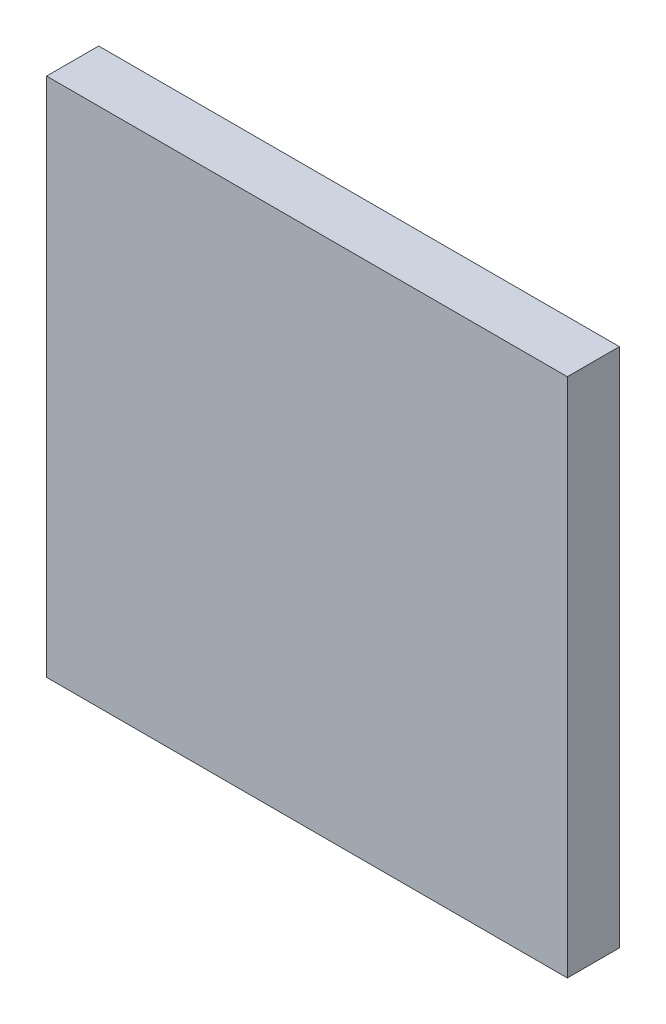
ISO-10303-21;
HEADER;
FILE_DESCRIPTION(('STEP AP214'),'2;1');
FILE_NAME('part.step','',(''),(''),'','','');
FILE_SCHEMA(('AUTOMOTIVE_DESIGN { 1 0 10303 214 1 1 1 1 }'));
ENDSEC;
DATA;
#1=APPLICATION_CONTEXT('core data for automotive mechanical design processes');
#2=APPLICATION_PROTOCOL_DEFINITION('international standard','automotive_design',2000,#1);
#3=PRODUCT_CONTEXT('',#1,'mechanical');
#4=PRODUCT('Part','Part','',(#3));
#5=PRODUCT_RELATED_PRODUCT_CATEGORY('part','',(#4));
#6=PRODUCT_DEFINITION_FORMATION('','',#4);
#7=PRODUCT_DEFINITION_CONTEXT('part definition',#1,'design');
#8=PRODUCT_DEFINITION('design','',#6,#7);
#9=PRODUCT_DEFINITION_SHAPE('','',#8);
#10=(LENGTH_UNIT() NAMED_UNIT(*) SI_UNIT(.MILLI.,.METRE.));
#11=(NAMED_UNIT(*) PLANE_ANGLE_UNIT() SI_UNIT($,.RADIAN.));
#12=(NAMED_UNIT(*) SI_UNIT($,.STERADIAN.) SOLID_ANGLE_UNIT());
#13=UNCERTAINTY_MEASURE_WITH_UNIT(LENGTH_MEASURE(1.E-05),#10,'distance_accuracy_value','');
#14=(GEOMETRIC_REPRESENTATION_CONTEXT(3) GLOBAL_UNCERTAINTY_ASSIGNED_CONTEXT((#13)) GLOBAL_UNIT_ASSIGNED_CONTEXT((#10,
#11,#12)) REPRESENTATION_CONTEXT('',''));
#15=CARTESIAN_POINT('',(0.,0.,0.));
#16=DIRECTION('',(0.,0.,1.));
#17=DIRECTION('',(1.,0.,0.));
#18=AXIS2_PLACEMENT_3D('',#15,#16,#17);
#19=CARTESIAN_POINT('',(-43.1972789115646,28.4013605442177,15.));
#20=DIRECTION('',(1.,0.,0.));
#21=DIRECTION('',(0.,1.,0.));
#22=AXIS2_PLACEMENT_3D('',#19,#20,#21);
#23=PLANE('',#22);
#24=DIRECTION('',(0.,-1.,0.));
#25=VECTOR('',#24,1.);
#26=CARTESIAN_POINT('',(-43.1972789115646,28.4013605442177,0.));
#27=LINE('',#26,#25);
#28=CARTESIAN_POINT('',(-43.1972789115646,28.4013605442177,0.));
#29=VERTEX_POINT('',#28);
#30=CARTESIAN_POINT('',(-43.1972789115646,-121.598639455782,0.));
#31=VERTEX_POINT('',#30);
#32=EDGE_CURVE('E107',#29,#31,#27,.T.);
#33=ORIENTED_EDGE('',*,*,#32,.T.);
#34=DIRECTION('',(0.,0.,-1.));
#35=VECTOR('',#34,1.);
#36=CARTESIAN_POINT('',(-43.1972789115646,-121.598639455782,15.));
#37=LINE('',#36,#35);
#38=CARTESIAN_POINT('',(-43.1972789115646,-121.598639455782,15.));
#39=VERTEX_POINT('',#38);
#40=EDGE_CURVE('E11',#39,#31,#37,.T.);
#41=ORIENTED_EDGE('',*,*,#40,.F.);
#42=DIRECTION('',(0.,-1.,0.));
#43=VECTOR('',#42,1.);
#44=CARTESIAN_POINT('',(-43.1972789115646,28.4013605442177,15.));
#45=LINE('',#44,#43);
#46=CARTESIAN_POINT('',(-43.1972789115646,28.4013605442177,15.));
#47=VERTEX_POINT('',#46);
#48=EDGE_CURVE('E91',#47,#39,#45,.T.);
#49=ORIENTED_EDGE('',*,*,#48,.F.);
#50=DIRECTION('',(0.,0.,-1.));
#51=VECTOR('',#50,1.);
#52=CARTESIAN_POINT('',(-43.1972789115646,28.4013605442177,15.));
#53=LINE('',#52,#51);
#54=EDGE_CURVE('E103',#47,#29,#53,.T.);
#55=ORIENTED_EDGE('',*,*,#54,.T.);
#56=EDGE_LOOP('',(#33,#41,#49,#55));
#57=FACE_BOUND('',#56,.T.);
#58=ADVANCED_FACE('F39',(#57),#23,.F.);
#59=CARTESIAN_POINT('',(-43.1972789115646,-121.598639455782,15.));
#60=DIRECTION('',(0.,1.,0.));
#61=DIRECTION('',(0.,0.,1.));
#62=AXIS2_PLACEMENT_3D('',#59,#60,#61);
#63=PLANE('',#62);
#64=DIRECTION('',(1.,0.,0.));
#65=VECTOR('',#64,1.);
#66=CARTESIAN_POINT('',(-43.1972789115646,-121.598639455782,0.));
#67=LINE('',#66,#65);
#68=CARTESIAN_POINT('',(106.802721088435,-121.598639455782,0.));
#69=VERTEX_POINT('',#68);
#70=EDGE_CURVE('E96',#31,#69,#67,.T.);
#71=ORIENTED_EDGE('',*,*,#70,.T.);
#72=DIRECTION('',(0.,0.,-1.));
#73=VECTOR('',#72,1.);
#74=CARTESIAN_POINT('',(106.802721088435,-121.598639455782,15.));
#75=LINE('',#74,#73);
#76=CARTESIAN_POINT('',(106.802721088435,-121.598639455782,15.));
#77=VERTEX_POINT('',#76);
#78=EDGE_CURVE('E48',#77,#69,#75,.T.);
#79=ORIENTED_EDGE('',*,*,#78,.F.);
#80=DIRECTION('',(1.,0.,0.));
#81=VECTOR('',#80,1.);
#82=CARTESIAN_POINT('',(-43.1972789115646,-121.598639455782,15.));
#83=LINE('',#82,#81);
#84=EDGE_CURVE('E86',#39,#77,#83,.T.);
#85=ORIENTED_EDGE('',*,*,#84,.F.);
#86=ORIENTED_EDGE('',*,*,#40,.T.);
#87=EDGE_LOOP('',(#71,#79,#85,#86));
#88=FACE_BOUND('',#87,.T.);
#89=ADVANCED_FACE('F95',(#88),#63,.F.);
#90=CARTESIAN_POINT('',(106.802721088435,28.4013605442177,15.));
#91=DIRECTION('',(-1.,0.,0.));
#92=DIRECTION('',(0.,-1.,0.));
#93=AXIS2_PLACEMENT_3D('',#90,#91,#92);
#94=PLANE('',#93);
#95=DIRECTION('',(0.,1.,0.));
#96=VECTOR('',#95,1.);
#97=CARTESIAN_POINT('',(106.802721088435,28.4013605442177,0.));
#98=LINE('',#97,#96);
#99=CARTESIAN_POINT('',(106.802721088435,28.4013605442177,0.));
#100=VERTEX_POINT('',#99);
#101=EDGE_CURVE('E73',#69,#100,#98,.T.);
#102=ORIENTED_EDGE('',*,*,#101,.T.);
#103=DIRECTION('',(0.,0.,-1.));
#104=VECTOR('',#103,1.);
#105=CARTESIAN_POINT('',(106.802721088435,28.4013605442177,15.));
#106=LINE('',#105,#104);
#107=CARTESIAN_POINT('',(106.802721088435,28.4013605442177,15.));
#108=VERTEX_POINT('',#107);
#109=EDGE_CURVE('E98',#108,#100,#106,.T.);
#110=ORIENTED_EDGE('',*,*,#109,.F.);
#111=DIRECTION('',(0.,1.,0.));
#112=VECTOR('',#111,1.);
#113=CARTESIAN_POINT('',(106.802721088435,28.4013605442177,15.));
#114=LINE('',#113,#112);
#115=EDGE_CURVE('E89',#77,#108,#114,.T.);
#116=ORIENTED_EDGE('',*,*,#115,.F.);
#117=ORIENTED_EDGE('',*,*,#78,.T.);
#118=EDGE_LOOP('',(#102,#110,#116,#117));
#119=FACE_BOUND('',#118,.T.);
#120=ADVANCED_FACE('F99',(#119),#94,.F.);
#121=CARTESIAN_POINT('',(-43.1972789115646,28.4013605442177,15.));
#122=DIRECTION('',(0.,-1.,0.));
#123=DIRECTION('',(0.,0.,-1.));
#124=AXIS2_PLACEMENT_3D('',#121,#122,#123);
#125=PLANE('',#124);
#126=DIRECTION('',(-1.,0.,0.));
#127=VECTOR('',#126,1.);
#128=CARTESIAN_POINT('',(-43.1972789115646,28.4013605442177,0.));
#129=LINE('',#128,#127);
#130=EDGE_CURVE('E79',#100,#29,#129,.T.);
#131=ORIENTED_EDGE('',*,*,#130,.T.);
#132=ORIENTED_EDGE('',*,*,#54,.F.);
#133=DIRECTION('',(-1.,0.,0.));
#134=VECTOR('',#133,1.);
#135=CARTESIAN_POINT('',(-43.1972789115646,28.4013605442177,15.));
#136=LINE('',#135,#134);
#137=EDGE_CURVE('E56',#108,#47,#136,.T.);
#138=ORIENTED_EDGE('',*,*,#137,.F.);
#139=ORIENTED_EDGE('',*,*,#109,.T.);
#140=EDGE_LOOP('',(#131,#132,#138,#139));
#141=FACE_BOUND('',#140,.T.);
#142=ADVANCED_FACE('F120',(#141),#125,.F.);
#143=CARTESIAN_POINT('',(0.,0.,15.));
#144=DIRECTION('',(0.,0.,1.));
#145=DIRECTION('',(1.,0.,0.));
#146=AXIS2_PLACEMENT_3D('',#143,#144,#145);
#147=PLANE('',#146);
#148=ORIENTED_EDGE('',*,*,#48,.T.);
#149=ORIENTED_EDGE('',*,*,#84,.T.);
#150=ORIENTED_EDGE('',*,*,#115,.T.);
#151=ORIENTED_EDGE('',*,*,#137,.T.);
#152=EDGE_LOOP('',(#148,#149,#150,#151));
#153=FACE_BOUND('',#152,.T.);
#154=ADVANCED_FACE('F87',(#153),#147,.T.);
#155=CARTESIAN_POINT('',(0.,0.,0.));
#156=DIRECTION('',(0.,0.,1.));
#157=DIRECTION('',(1.,0.,0.));
#158=AXIS2_PLACEMENT_3D('',#155,#156,#157);
#159=PLANE('',#158);
#160=ORIENTED_EDGE('',*,*,#32,.F.);
#161=ORIENTED_EDGE('',*,*,#130,.F.);
#162=ORIENTED_EDGE('',*,*,#101,.F.);
#163=ORIENTED_EDGE('',*,*,#70,.F.);
#164=EDGE_LOOP('',(#160,#161,#162,#163));
#165=FACE_BOUND('',#164,.T.);
#166=ADVANCED_FACE('F123',(#165),#159,.F.);
#167=CLOSED_SHELL('',(#58,#89,#120,#142,#154,#166));
#168=MANIFOLD_SOLID_BREP('B2',#167);
#169=ADVANCED_BREP_SHAPE_REPRESENTATION('',(#18,#168),#14);
#170=SHAPE_DEFINITION_REPRESENTATION(#9,#169);
ENDSEC;
END-ISO-10303-21;
